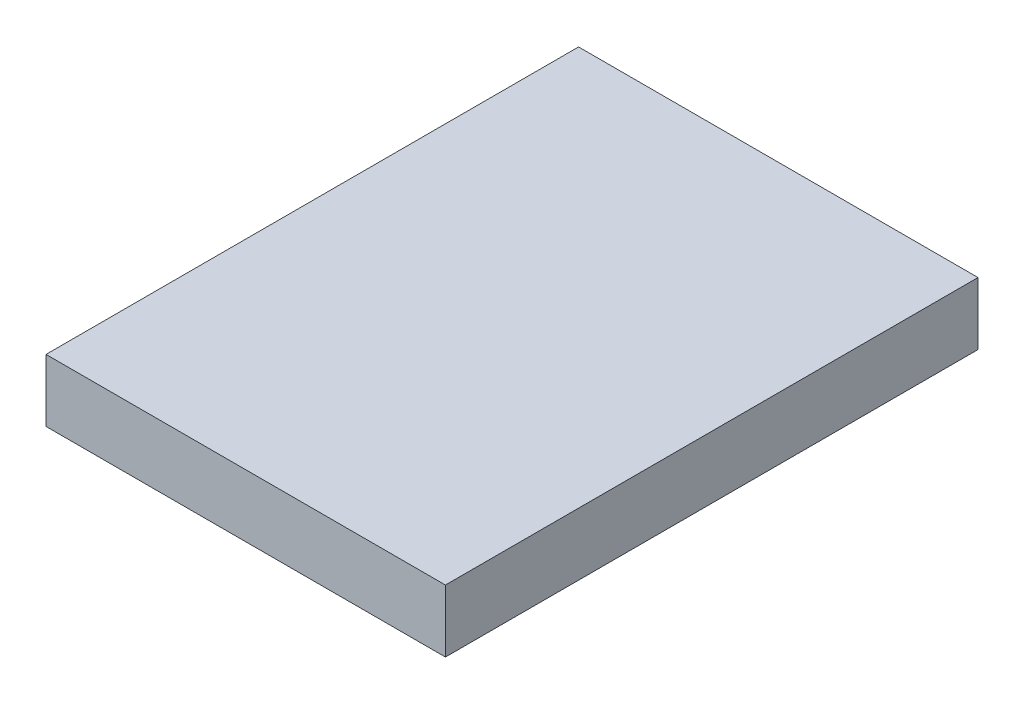
ISO-10303-21;
HEADER;
FILE_DESCRIPTION(('STEP AP214'),'2;1');
FILE_NAME('part.step','',(''),(''),'','','');
FILE_SCHEMA(('AUTOMOTIVE_DESIGN { 1 0 10303 214 1 1 1 1 }'));
ENDSEC;
DATA;
#1=APPLICATION_CONTEXT('core data for automotive mechanical design processes');
#2=APPLICATION_PROTOCOL_DEFINITION('international standard','automotive_design',2000,#1);
#3=PRODUCT_CONTEXT('',#1,'mechanical');
#4=PRODUCT('Part','Part','',(#3));
#5=PRODUCT_RELATED_PRODUCT_CATEGORY('part','',(#4));
#6=PRODUCT_DEFINITION_FORMATION('','',#4);
#7=PRODUCT_DEFINITION_CONTEXT('part definition',#1,'design');
#8=PRODUCT_DEFINITION('design','',#6,#7);
#9=PRODUCT_DEFINITION_SHAPE('','',#8);
#10=(LENGTH_UNIT() NAMED_UNIT(*) SI_UNIT(.MILLI.,.METRE.));
#11=(NAMED_UNIT(*) PLANE_ANGLE_UNIT() SI_UNIT($,.RADIAN.));
#12=(NAMED_UNIT(*) SI_UNIT($,.STERADIAN.) SOLID_ANGLE_UNIT());
#13=UNCERTAINTY_MEASURE_WITH_UNIT(LENGTH_MEASURE(1.E-05),#10,'distance_accuracy_value','');
#14=(GEOMETRIC_REPRESENTATION_CONTEXT(3) GLOBAL_UNCERTAINTY_ASSIGNED_CONTEXT((#13)) GLOBAL_UNIT_ASSIGNED_CONTEXT((#10,
#11,#12)) REPRESENTATION_CONTEXT('',''));
#15=CARTESIAN_POINT('',(0.,0.,0.));
#16=DIRECTION('',(0.,0.,1.));
#17=DIRECTION('',(1.,0.,0.));
#18=AXIS2_PLACEMENT_3D('',#15,#16,#17);
#19=CARTESIAN_POINT('',(24.,7.5,32.));
#20=DIRECTION('',(-1.,0.,0.));
#21=DIRECTION('',(0.,0.,1.));
#22=AXIS2_PLACEMENT_3D('',#19,#20,#21);
#23=PLANE('',#22);
#24=DIRECTION('',(0.,0.,-1.));
#25=VECTOR('',#24,1.);
#26=CARTESIAN_POINT('',(24.,0.,32.));
#27=LINE('',#26,#25);
#28=CARTESIAN_POINT('',(24.,0.,32.));
#29=VERTEX_POINT('',#28);
#30=CARTESIAN_POINT('',(24.,0.,-32.));
#31=VERTEX_POINT('',#30);
#32=EDGE_CURVE('E96',#29,#31,#27,.T.);
#33=ORIENTED_EDGE('',*,*,#32,.T.);
#34=DIRECTION('',(0.,-1.,0.));
#35=VECTOR('',#34,1.);
#36=CARTESIAN_POINT('',(24.,7.5,-32.));
#37=LINE('',#36,#35);
#38=CARTESIAN_POINT('',(24.,7.5,-32.));
#39=VERTEX_POINT('',#38);
#40=EDGE_CURVE('E11',#39,#31,#37,.T.);
#41=ORIENTED_EDGE('',*,*,#40,.F.);
#42=DIRECTION('',(0.,0.,-1.));
#43=VECTOR('',#42,1.);
#44=CARTESIAN_POINT('',(24.,7.5,32.));
#45=LINE('',#44,#43);
#46=CARTESIAN_POINT('',(24.,7.5,32.));
#47=VERTEX_POINT('',#46);
#48=EDGE_CURVE('E84',#47,#39,#45,.T.);
#49=ORIENTED_EDGE('',*,*,#48,.F.);
#50=DIRECTION('',(0.,-1.,0.));
#51=VECTOR('',#50,1.);
#52=CARTESIAN_POINT('',(24.,7.5,32.));
#53=LINE('',#52,#51);
#54=EDGE_CURVE('E92',#47,#29,#53,.T.);
#55=ORIENTED_EDGE('',*,*,#54,.T.);
#56=EDGE_LOOP('',(#33,#41,#49,#55));
#57=FACE_BOUND('',#56,.T.);
#58=ADVANCED_FACE('F33',(#57),#23,.F.);
#59=CARTESIAN_POINT('',(-24.,7.5,-32.));
#60=DIRECTION('',(0.,0.,1.));
#61=DIRECTION('',(1.,0.,0.));
#62=AXIS2_PLACEMENT_3D('',#59,#60,#61);
#63=PLANE('',#62);
#64=DIRECTION('',(-1.,0.,0.));
#65=VECTOR('',#64,1.);
#66=CARTESIAN_POINT('',(-24.,0.,-32.));
#67=LINE('',#66,#65);
#68=CARTESIAN_POINT('',(-24.,0.,-32.));
#69=VERTEX_POINT('',#68);
#70=EDGE_CURVE('E88',#31,#69,#67,.T.);
#71=ORIENTED_EDGE('',*,*,#70,.T.);
#72=DIRECTION('',(0.,-1.,0.));
#73=VECTOR('',#72,1.);
#74=CARTESIAN_POINT('',(-24.,7.5,-32.));
#75=LINE('',#74,#73);
#76=CARTESIAN_POINT('',(-24.,7.5,-32.));
#77=VERTEX_POINT('',#76);
#78=EDGE_CURVE('E41',#77,#69,#75,.T.);
#79=ORIENTED_EDGE('',*,*,#78,.F.);
#80=DIRECTION('',(-1.,0.,0.));
#81=VECTOR('',#80,1.);
#82=CARTESIAN_POINT('',(-24.,7.5,-32.));
#83=LINE('',#82,#81);
#84=EDGE_CURVE('E79',#39,#77,#83,.T.);
#85=ORIENTED_EDGE('',*,*,#84,.F.);
#86=ORIENTED_EDGE('',*,*,#40,.T.);
#87=EDGE_LOOP('',(#71,#79,#85,#86));
#88=FACE_BOUND('',#87,.T.);
#89=ADVANCED_FACE('F87',(#88),#63,.F.);
#90=CARTESIAN_POINT('',(-24.,7.5,32.));
#91=DIRECTION('',(1.,0.,0.));
#92=DIRECTION('',(0.,0.,-1.));
#93=AXIS2_PLACEMENT_3D('',#90,#91,#92);
#94=PLANE('',#93);
#95=DIRECTION('',(0.,0.,1.));
#96=VECTOR('',#95,1.);
#97=CARTESIAN_POINT('',(-24.,0.,32.));
#98=LINE('',#97,#96);
#99=CARTESIAN_POINT('',(-24.,0.,32.));
#100=VERTEX_POINT('',#99);
#101=EDGE_CURVE('E66',#69,#100,#98,.T.);
#102=ORIENTED_EDGE('',*,*,#101,.T.);
#103=DIRECTION('',(0.,-1.,0.));
#104=VECTOR('',#103,1.);
#105=CARTESIAN_POINT('',(-24.,7.5,32.));
#106=LINE('',#105,#104);
#107=CARTESIAN_POINT('',(-24.,7.5,32.));
#108=VERTEX_POINT('',#107);
#109=EDGE_CURVE('E89',#108,#100,#106,.T.);
#110=ORIENTED_EDGE('',*,*,#109,.F.);
#111=DIRECTION('',(0.,0.,1.));
#112=VECTOR('',#111,1.);
#113=CARTESIAN_POINT('',(-24.,7.5,32.));
#114=LINE('',#113,#112);
#115=EDGE_CURVE('E82',#77,#108,#114,.T.);
#116=ORIENTED_EDGE('',*,*,#115,.F.);
#117=ORIENTED_EDGE('',*,*,#78,.T.);
#118=EDGE_LOOP('',(#102,#110,#116,#117));
#119=FACE_BOUND('',#118,.T.);
#120=ADVANCED_FACE('F90',(#119),#94,.F.);
#121=CARTESIAN_POINT('',(-24.,7.5,32.));
#122=DIRECTION('',(0.,0.,-1.));
#123=DIRECTION('',(-1.,0.,0.));
#124=AXIS2_PLACEMENT_3D('',#121,#122,#123);
#125=PLANE('',#124);
#126=DIRECTION('',(1.,0.,0.));
#127=VECTOR('',#126,1.);
#128=CARTESIAN_POINT('',(-24.,0.,32.));
#129=LINE('',#128,#127);
#130=EDGE_CURVE('E72',#100,#29,#129,.T.);
#131=ORIENTED_EDGE('',*,*,#130,.T.);
#132=ORIENTED_EDGE('',*,*,#54,.F.);
#133=DIRECTION('',(1.,0.,0.));
#134=VECTOR('',#133,1.);
#135=CARTESIAN_POINT('',(-24.,7.5,32.));
#136=LINE('',#135,#134);
#137=EDGE_CURVE('E49',#108,#47,#136,.T.);
#138=ORIENTED_EDGE('',*,*,#137,.F.);
#139=ORIENTED_EDGE('',*,*,#109,.T.);
#140=EDGE_LOOP('',(#131,#132,#138,#139));
#141=FACE_BOUND('',#140,.T.);
#142=ADVANCED_FACE('F103',(#141),#125,.F.);
#143=CARTESIAN_POINT('',(0.,7.5,0.));
#144=DIRECTION('',(0.,-1.,0.));
#145=DIRECTION('',(0.,0.,-1.));
#146=AXIS2_PLACEMENT_3D('',#143,#144,#145);
#147=PLANE('',#146);
#148=ORIENTED_EDGE('',*,*,#48,.T.);
#149=ORIENTED_EDGE('',*,*,#84,.T.);
#150=ORIENTED_EDGE('',*,*,#115,.T.);
#151=ORIENTED_EDGE('',*,*,#137,.T.);
#152=EDGE_LOOP('',(#148,#149,#150,#151));
#153=FACE_BOUND('',#152,.T.);
#154=ADVANCED_FACE('F80',(#153),#147,.F.);
#155=CARTESIAN_POINT('',(0.,0.,0.));
#156=DIRECTION('',(0.,-1.,0.));
#157=DIRECTION('',(0.,0.,-1.));
#158=AXIS2_PLACEMENT_3D('',#155,#156,#157);
#159=PLANE('',#158);
#160=ORIENTED_EDGE('',*,*,#32,.F.);
#161=ORIENTED_EDGE('',*,*,#130,.F.);
#162=ORIENTED_EDGE('',*,*,#101,.F.);
#163=ORIENTED_EDGE('',*,*,#70,.F.);
#164=EDGE_LOOP('',(#160,#161,#162,#163));
#165=FACE_BOUND('',#164,.T.);
#166=ADVANCED_FACE('F106',(#165),#159,.T.);
#167=CLOSED_SHELL('',(#58,#89,#120,#142,#154,#166));
#168=MANIFOLD_SOLID_BREP('B2',#167);
#169=ADVANCED_BREP_SHAPE_REPRESENTATION('',(#18,#168),#14);
#170=SHAPE_DEFINITION_REPRESENTATION(#9,#169);
ENDSEC;
END-ISO-10303-21;
